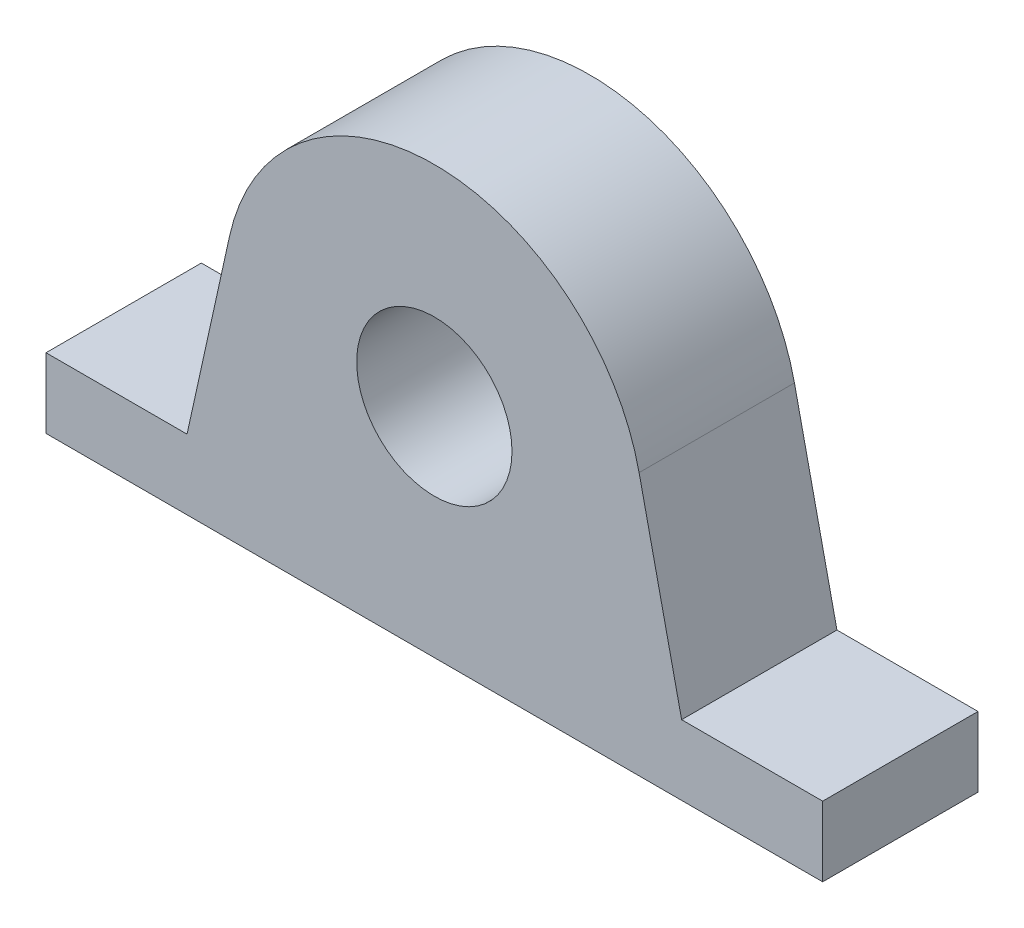
ISO-10303-21;
HEADER;
FILE_DESCRIPTION(('STEP AP214'),'2;1');
FILE_NAME('part.step','',(''),(''),'','','');
FILE_SCHEMA(('AUTOMOTIVE_DESIGN { 1 0 10303 214 1 1 1 1 }'));
ENDSEC;
DATA;
#1=APPLICATION_CONTEXT('core data for automotive mechanical design processes');
#2=APPLICATION_PROTOCOL_DEFINITION('international standard','automotive_design',2000,#1);
#3=PRODUCT_CONTEXT('',#1,'mechanical');
#4=PRODUCT('Part','Part','',(#3));
#5=PRODUCT_RELATED_PRODUCT_CATEGORY('part','',(#4));
#6=PRODUCT_DEFINITION_FORMATION('','',#4);
#7=PRODUCT_DEFINITION_CONTEXT('part definition',#1,'design');
#8=PRODUCT_DEFINITION('design','',#6,#7);
#9=PRODUCT_DEFINITION_SHAPE('','',#8);
#10=(LENGTH_UNIT() NAMED_UNIT(*) SI_UNIT(.MILLI.,.METRE.));
#11=(NAMED_UNIT(*) PLANE_ANGLE_UNIT() SI_UNIT($,.RADIAN.));
#12=(NAMED_UNIT(*) SI_UNIT($,.STERADIAN.) SOLID_ANGLE_UNIT());
#13=UNCERTAINTY_MEASURE_WITH_UNIT(LENGTH_MEASURE(1.E-05),#10,'distance_accuracy_value','');
#14=(GEOMETRIC_REPRESENTATION_CONTEXT(3) GLOBAL_UNCERTAINTY_ASSIGNED_CONTEXT((#13)) GLOBAL_UNIT_ASSIGNED_CONTEXT((#10,
#11,#12)) REPRESENTATION_CONTEXT('',''));
#15=CARTESIAN_POINT('',(0.,0.,0.));
#16=DIRECTION('',(0.,0.,1.));
#17=DIRECTION('',(1.,0.,0.));
#18=AXIS2_PLACEMENT_3D('',#15,#16,#17);
#19=CARTESIAN_POINT('',(0.,28.,20.));
#20=DIRECTION('',(0.,0.,-1.));
#21=DIRECTION('',(-1.,0.,0.));
#22=AXIS2_PLACEMENT_3D('',#19,#20,#21);
#23=PLANE('',#22);
#24=DIRECTION('',(-1.,0.,0.));
#25=VECTOR('',#24,1.);
#26=CARTESIAN_POINT('',(-50.,8.99999999999999,20.));
#27=LINE('',#26,#25);
#28=CARTESIAN_POINT('',(-31.8397917532023,8.99999999999999,20.));
#29=VERTEX_POINT('',#28);
#30=CARTESIAN_POINT('',(-50.,8.99999999999999,20.));
#31=VERTEX_POINT('',#30);
#32=EDGE_CURVE('E146',#29,#31,#27,.T.);
#33=ORIENTED_EDGE('',*,*,#32,.T.);
#34=DIRECTION('',(0.,-1.,0.));
#35=VECTOR('',#34,1.);
#36=CARTESIAN_POINT('',(-50.,0.,20.));
#37=LINE('',#36,#35);
#38=CARTESIAN_POINT('',(-50.,0.,20.));
#39=VERTEX_POINT('',#38);
#40=EDGE_CURVE('E94',#31,#39,#37,.T.);
#41=ORIENTED_EDGE('',*,*,#40,.T.);
#42=DIRECTION('',(1.,0.,0.));
#43=VECTOR('',#42,1.);
#44=CARTESIAN_POINT('',(50.,0.,20.));
#45=LINE('',#44,#43);
#46=CARTESIAN_POINT('',(50.,0.,20.));
#47=VERTEX_POINT('',#46);
#48=EDGE_CURVE('E162',#39,#47,#45,.T.);
#49=ORIENTED_EDGE('',*,*,#48,.T.);
#50=DIRECTION('',(0.,1.,0.));
#51=VECTOR('',#50,1.);
#52=CARTESIAN_POINT('',(50.,0.,20.));
#53=LINE('',#52,#51);
#54=CARTESIAN_POINT('',(50.,8.99999999999999,20.));
#55=VERTEX_POINT('',#54);
#56=EDGE_CURVE('E175',#47,#55,#53,.T.);
#57=ORIENTED_EDGE('',*,*,#56,.T.);
#58=DIRECTION('',(-1.,0.,0.));
#59=VECTOR('',#58,1.);
#60=CARTESIAN_POINT('',(50.,8.99999999999999,20.));
#61=LINE('',#60,#59);
#62=CARTESIAN_POINT('',(31.8397917532023,8.99999999999999,20.));
#63=VERTEX_POINT('',#62);
#64=EDGE_CURVE('E113',#55,#63,#61,.T.);
#65=ORIENTED_EDGE('',*,*,#64,.T.);
#66=DIRECTION('',(-0.215391599960152,0.976527756219252,0.));
#67=VECTOR('',#66,1.);
#68=CARTESIAN_POINT('',(31.8397917532023,8.99999999999999,20.));
#69=LINE('',#68,#67);
#70=CARTESIAN_POINT('',(26.3662494179198,33.8155731989241,20.));
#71=VERTEX_POINT('',#70);
#72=EDGE_CURVE('E107',#63,#71,#69,.T.);
#73=ORIENTED_EDGE('',*,*,#72,.T.);
#74=CARTESIAN_POINT('',(0.,28.,20.));
#75=DIRECTION('',(0.,0.,1.));
#76=DIRECTION('',(-1.,0.,0.));
#77=AXIS2_PLACEMENT_3D('',#74,#75,#76);
#78=CIRCLE('',#77,27.);
#79=CARTESIAN_POINT('',(-26.3662494179198,33.8155731989241,20.));
#80=VERTEX_POINT('',#79);
#81=EDGE_CURVE('E111',#71,#80,#78,.T.);
#82=ORIENTED_EDGE('',*,*,#81,.T.);
#83=DIRECTION('',(-0.215391599960152,-0.976527756219252,0.));
#84=VECTOR('',#83,1.);
#85=CARTESIAN_POINT('',(-31.8397917532023,8.99999999999999,20.));
#86=LINE('',#85,#84);
#87=EDGE_CURVE('E51',#80,#29,#86,.T.);
#88=ORIENTED_EDGE('',*,*,#87,.T.);
#89=EDGE_LOOP('',(#33,#41,#49,#57,#65,#73,#82,#88));
#90=FACE_BOUND('',#89,.T.);
#91=CARTESIAN_POINT('',(0.,28.,20.));
#92=DIRECTION('',(0.,0.,1.));
#93=DIRECTION('',(1.,0.,0.));
#94=AXIS2_PLACEMENT_3D('',#91,#92,#93);
#95=CIRCLE('',#94,10.);
#96=CARTESIAN_POINT('',(10.,28.,20.));
#97=VERTEX_POINT('',#96);
#98=EDGE_CURVE('E135',#97,#97,#95,.T.);
#99=ORIENTED_EDGE('',*,*,#98,.F.);
#100=EDGE_LOOP('',(#99));
#101=FACE_BOUND('',#100,.T.);
#102=ADVANCED_FACE('F34',(#90,#101),#23,.F.);
#103=CARTESIAN_POINT('',(0.,28.,0.));
#104=DIRECTION('',(0.,0.,-1.));
#105=DIRECTION('',(-1.,0.,0.));
#106=AXIS2_PLACEMENT_3D('',#103,#104,#105);
#107=PLANE('',#106);
#108=DIRECTION('',(-1.,0.,0.));
#109=VECTOR('',#108,1.);
#110=CARTESIAN_POINT('',(-50.,8.99999999999999,0.));
#111=LINE('',#110,#109);
#112=CARTESIAN_POINT('',(-31.8397917532023,8.99999999999999,0.));
#113=VERTEX_POINT('',#112);
#114=CARTESIAN_POINT('',(-50.,8.99999999999999,0.));
#115=VERTEX_POINT('',#114);
#116=EDGE_CURVE('E131',#113,#115,#111,.T.);
#117=ORIENTED_EDGE('',*,*,#116,.F.);
#118=DIRECTION('',(-0.215391599960152,-0.976527756219252,0.));
#119=VECTOR('',#118,1.);
#120=CARTESIAN_POINT('',(-31.8397917532023,8.99999999999999,0.));
#121=LINE('',#120,#119);
#122=CARTESIAN_POINT('',(-26.3662494179198,33.8155731989241,0.));
#123=VERTEX_POINT('',#122);
#124=EDGE_CURVE('E86',#123,#113,#121,.T.);
#125=ORIENTED_EDGE('',*,*,#124,.F.);
#126=CARTESIAN_POINT('',(0.,28.,0.));
#127=DIRECTION('',(0.,0.,1.));
#128=DIRECTION('',(-1.,0.,0.));
#129=AXIS2_PLACEMENT_3D('',#126,#127,#128);
#130=CIRCLE('',#129,27.);
#131=CARTESIAN_POINT('',(26.3662494179198,33.8155731989241,0.));
#132=VERTEX_POINT('',#131);
#133=EDGE_CURVE('E80',#132,#123,#130,.T.);
#134=ORIENTED_EDGE('',*,*,#133,.F.);
#135=DIRECTION('',(-0.215391599960152,0.976527756219252,0.));
#136=VECTOR('',#135,1.);
#137=CARTESIAN_POINT('',(31.8397917532023,8.99999999999999,0.));
#138=LINE('',#137,#136);
#139=CARTESIAN_POINT('',(31.8397917532023,8.99999999999999,0.));
#140=VERTEX_POINT('',#139);
#141=EDGE_CURVE('E121',#140,#132,#138,.T.);
#142=ORIENTED_EDGE('',*,*,#141,.F.);
#143=DIRECTION('',(-1.,0.,0.));
#144=VECTOR('',#143,1.);
#145=CARTESIAN_POINT('',(50.,8.99999999999999,0.));
#146=LINE('',#145,#144);
#147=CARTESIAN_POINT('',(50.,8.99999999999999,0.));
#148=VERTEX_POINT('',#147);
#149=EDGE_CURVE('E141',#148,#140,#146,.T.);
#150=ORIENTED_EDGE('',*,*,#149,.F.);
#151=DIRECTION('',(0.,1.,0.));
#152=VECTOR('',#151,1.);
#153=CARTESIAN_POINT('',(50.,0.,0.));
#154=LINE('',#153,#152);
#155=CARTESIAN_POINT('',(50.,0.,0.));
#156=VERTEX_POINT('',#155);
#157=EDGE_CURVE('E139',#156,#148,#154,.T.);
#158=ORIENTED_EDGE('',*,*,#157,.F.);
#159=DIRECTION('',(1.,0.,0.));
#160=VECTOR('',#159,1.);
#161=CARTESIAN_POINT('',(50.,0.,0.));
#162=LINE('',#161,#160);
#163=CARTESIAN_POINT('',(-50.,0.,0.));
#164=VERTEX_POINT('',#163);
#165=EDGE_CURVE('E137',#164,#156,#162,.T.);
#166=ORIENTED_EDGE('',*,*,#165,.F.);
#167=DIRECTION('',(0.,-1.,0.));
#168=VECTOR('',#167,1.);
#169=CARTESIAN_POINT('',(-50.,0.,0.));
#170=LINE('',#169,#168);
#171=EDGE_CURVE('E134',#115,#164,#170,.T.);
#172=ORIENTED_EDGE('',*,*,#171,.F.);
#173=EDGE_LOOP('',(#117,#125,#134,#142,#150,#158,#166,#172));
#174=FACE_BOUND('',#173,.T.);
#175=CARTESIAN_POINT('',(0.,28.,0.));
#176=DIRECTION('',(0.,0.,1.));
#177=DIRECTION('',(1.,0.,0.));
#178=AXIS2_PLACEMENT_3D('',#175,#176,#177);
#179=CIRCLE('',#178,10.);
#180=CARTESIAN_POINT('',(10.,28.,0.));
#181=VERTEX_POINT('',#180);
#182=EDGE_CURVE('E181',#181,#181,#179,.T.);
#183=ORIENTED_EDGE('',*,*,#182,.T.);
#184=EDGE_LOOP('',(#183));
#185=FACE_BOUND('',#184,.T.);
#186=ADVANCED_FACE('F166',(#174,#185),#107,.T.);
#187=CARTESIAN_POINT('',(-50.,8.99999999999999,20.));
#188=DIRECTION('',(0.,-1.,0.));
#189=DIRECTION('',(0.,0.,-1.));
#190=AXIS2_PLACEMENT_3D('',#187,#188,#189);
#191=PLANE('',#190);
#192=ORIENTED_EDGE('',*,*,#116,.T.);
#193=DIRECTION('',(0.,0.,-1.));
#194=VECTOR('',#193,1.);
#195=CARTESIAN_POINT('',(-50.,8.99999999999999,20.));
#196=LINE('',#195,#194);
#197=EDGE_CURVE('E11',#31,#115,#196,.T.);
#198=ORIENTED_EDGE('',*,*,#197,.F.);
#199=ORIENTED_EDGE('',*,*,#32,.F.);
#200=DIRECTION('',(0.,0.,-1.));
#201=VECTOR('',#200,1.);
#202=CARTESIAN_POINT('',(-31.8397917532023,8.99999999999999,20.));
#203=LINE('',#202,#201);
#204=EDGE_CURVE('E127',#29,#113,#203,.T.);
#205=ORIENTED_EDGE('',*,*,#204,.T.);
#206=EDGE_LOOP('',(#192,#198,#199,#205));
#207=FACE_BOUND('',#206,.T.);
#208=ADVANCED_FACE('F36',(#207),#191,.F.);
#209=CARTESIAN_POINT('',(-50.,0.,20.));
#210=DIRECTION('',(1.,0.,0.));
#211=DIRECTION('',(0.,0.,-1.));
#212=AXIS2_PLACEMENT_3D('',#209,#210,#211);
#213=PLANE('',#212);
#214=ORIENTED_EDGE('',*,*,#171,.T.);
#215=DIRECTION('',(0.,0.,-1.));
#216=VECTOR('',#215,1.);
#217=CARTESIAN_POINT('',(-50.,0.,20.));
#218=LINE('',#217,#216);
#219=EDGE_CURVE('E43',#39,#164,#218,.T.);
#220=ORIENTED_EDGE('',*,*,#219,.F.);
#221=ORIENTED_EDGE('',*,*,#40,.F.);
#222=ORIENTED_EDGE('',*,*,#197,.T.);
#223=EDGE_LOOP('',(#214,#220,#221,#222));
#224=FACE_BOUND('',#223,.T.);
#225=ADVANCED_FACE('F209',(#224),#213,.F.);
#226=CARTESIAN_POINT('',(50.,0.,20.));
#227=DIRECTION('',(0.,1.,0.));
#228=DIRECTION('',(0.,0.,1.));
#229=AXIS2_PLACEMENT_3D('',#226,#227,#228);
#230=PLANE('',#229);
#231=ORIENTED_EDGE('',*,*,#165,.T.);
#232=DIRECTION('',(0.,0.,-1.));
#233=VECTOR('',#232,1.);
#234=CARTESIAN_POINT('',(50.,0.,20.));
#235=LINE('',#234,#233);
#236=EDGE_CURVE('E153',#47,#156,#235,.T.);
#237=ORIENTED_EDGE('',*,*,#236,.F.);
#238=ORIENTED_EDGE('',*,*,#48,.F.);
#239=ORIENTED_EDGE('',*,*,#219,.T.);
#240=EDGE_LOOP('',(#231,#237,#238,#239));
#241=FACE_BOUND('',#240,.T.);
#242=ADVANCED_FACE('F160',(#241),#230,.F.);
#243=CARTESIAN_POINT('',(50.,0.,20.));
#244=DIRECTION('',(-1.,0.,0.));
#245=DIRECTION('',(0.,0.,1.));
#246=AXIS2_PLACEMENT_3D('',#243,#244,#245);
#247=PLANE('',#246);
#248=ORIENTED_EDGE('',*,*,#157,.T.);
#249=DIRECTION('',(0.,0.,-1.));
#250=VECTOR('',#249,1.);
#251=CARTESIAN_POINT('',(50.,8.99999999999999,20.));
#252=LINE('',#251,#250);
#253=EDGE_CURVE('E150',#55,#148,#252,.T.);
#254=ORIENTED_EDGE('',*,*,#253,.F.);
#255=ORIENTED_EDGE('',*,*,#56,.F.);
#256=ORIENTED_EDGE('',*,*,#236,.T.);
#257=EDGE_LOOP('',(#248,#254,#255,#256));
#258=FACE_BOUND('',#257,.T.);
#259=ADVANCED_FACE('F171',(#258),#247,.F.);
#260=CARTESIAN_POINT('',(50.,8.99999999999999,20.));
#261=DIRECTION('',(0.,-1.,0.));
#262=DIRECTION('',(0.,0.,-1.));
#263=AXIS2_PLACEMENT_3D('',#260,#261,#262);
#264=PLANE('',#263);
#265=ORIENTED_EDGE('',*,*,#149,.T.);
#266=DIRECTION('',(0.,0.,-1.));
#267=VECTOR('',#266,1.);
#268=CARTESIAN_POINT('',(31.8397917532023,8.99999999999999,20.));
#269=LINE('',#268,#267);
#270=EDGE_CURVE('E122',#63,#140,#269,.T.);
#271=ORIENTED_EDGE('',*,*,#270,.F.);
#272=ORIENTED_EDGE('',*,*,#64,.F.);
#273=ORIENTED_EDGE('',*,*,#253,.T.);
#274=EDGE_LOOP('',(#265,#271,#272,#273));
#275=FACE_BOUND('',#274,.T.);
#276=ADVANCED_FACE('F174',(#275),#264,.F.);
#277=CARTESIAN_POINT('',(31.8397917532023,8.99999999999999,20.));
#278=DIRECTION('',(-0.976527756219252,-0.215391599960152,0.));
#279=DIRECTION('',(0.215391599960152,-0.976527756219252,0.));
#280=AXIS2_PLACEMENT_3D('',#277,#278,#279);
#281=PLANE('',#280);
#282=ORIENTED_EDGE('',*,*,#141,.T.);
#283=DIRECTION('',(0.,0.,-1.));
#284=VECTOR('',#283,1.);
#285=CARTESIAN_POINT('',(26.3662494179198,33.8155731989241,20.));
#286=LINE('',#285,#284);
#287=EDGE_CURVE('E118',#71,#132,#286,.T.);
#288=ORIENTED_EDGE('',*,*,#287,.F.);
#289=ORIENTED_EDGE('',*,*,#72,.F.);
#290=ORIENTED_EDGE('',*,*,#270,.T.);
#291=EDGE_LOOP('',(#282,#288,#289,#290));
#292=FACE_BOUND('',#291,.T.);
#293=ADVANCED_FACE('F119',(#292),#281,.F.);
#294=CARTESIAN_POINT('',(0.,28.,20.));
#295=DIRECTION('',(0.,0.,-1.));
#296=DIRECTION('',(-1.,0.,0.));
#297=AXIS2_PLACEMENT_3D('',#294,#295,#296);
#298=CYLINDRICAL_SURFACE('',#297,27.);
#299=ORIENTED_EDGE('',*,*,#133,.T.);
#300=DIRECTION('',(0.,0.,-1.));
#301=VECTOR('',#300,1.);
#302=CARTESIAN_POINT('',(-26.3662494179198,33.8155731989241,20.));
#303=LINE('',#302,#301);
#304=EDGE_CURVE('E123',#80,#123,#303,.T.);
#305=ORIENTED_EDGE('',*,*,#304,.F.);
#306=ORIENTED_EDGE('',*,*,#81,.F.);
#307=ORIENTED_EDGE('',*,*,#287,.T.);
#308=EDGE_LOOP('',(#299,#305,#306,#307));
#309=FACE_BOUND('',#308,.T.);
#310=ADVANCED_FACE('F125',(#309),#298,.T.);
#311=CARTESIAN_POINT('',(-31.8397917532023,8.99999999999999,20.));
#312=DIRECTION('',(0.976527756219252,-0.215391599960152,0.));
#313=DIRECTION('',(0.215391599960152,0.976527756219252,0.));
#314=AXIS2_PLACEMENT_3D('',#311,#312,#313);
#315=PLANE('',#314);
#316=ORIENTED_EDGE('',*,*,#124,.T.);
#317=ORIENTED_EDGE('',*,*,#204,.F.);
#318=ORIENTED_EDGE('',*,*,#87,.F.);
#319=ORIENTED_EDGE('',*,*,#304,.T.);
#320=EDGE_LOOP('',(#316,#317,#318,#319));
#321=FACE_BOUND('',#320,.T.);
#322=ADVANCED_FACE('F197',(#321),#315,.F.);
#323=CARTESIAN_POINT('',(0.,28.,20.));
#324=DIRECTION('',(0.,0.,-1.));
#325=DIRECTION('',(-1.,0.,0.));
#326=AXIS2_PLACEMENT_3D('',#323,#324,#325);
#327=CYLINDRICAL_SURFACE('',#326,10.);
#328=ORIENTED_EDGE('',*,*,#98,.T.);
#329=EDGE_LOOP('',(#328));
#330=FACE_BOUND('',#329,.T.);
#331=ORIENTED_EDGE('',*,*,#182,.F.);
#332=EDGE_LOOP('',(#331));
#333=FACE_BOUND('',#332,.T.);
#334=ADVANCED_FACE('F187',(#330,#333),#327,.F.);
#335=CLOSED_SHELL('',(#102,#186,#208,#225,#242,#259,#276,#293,#310,#322,#334));
#336=MANIFOLD_SOLID_BREP('B2',#335);
#337=ADVANCED_BREP_SHAPE_REPRESENTATION('',(#18,#336),#14);
#338=SHAPE_DEFINITION_REPRESENTATION(#9,#337);
ENDSEC;
END-ISO-10303-21;
